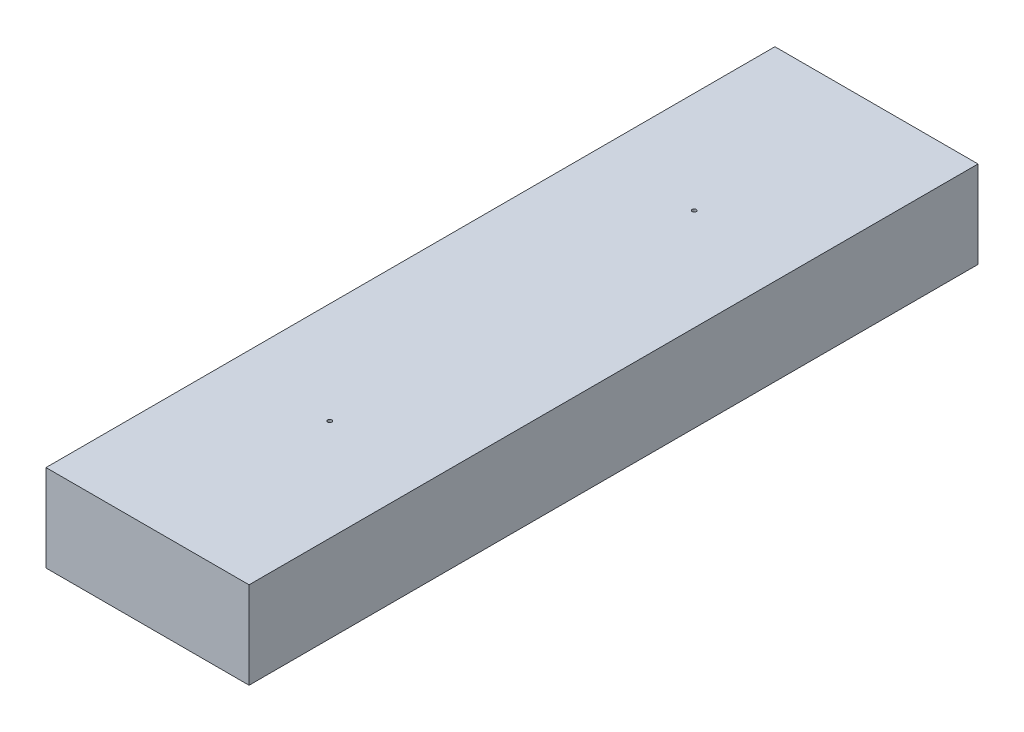
ISO-10303-21;
HEADER;
FILE_DESCRIPTION(('STEP AP214'),'2;1');
FILE_NAME('part.step','',(''),(''),'','','');
FILE_SCHEMA(('AUTOMOTIVE_DESIGN { 1 0 10303 214 1 1 1 1 }'));
ENDSEC;
DATA;
#1=APPLICATION_CONTEXT('core data for automotive mechanical design processes');
#2=APPLICATION_PROTOCOL_DEFINITION('international standard','automotive_design',2000,#1);
#3=PRODUCT_CONTEXT('',#1,'mechanical');
#4=PRODUCT('Part','Part','',(#3));
#5=PRODUCT_RELATED_PRODUCT_CATEGORY('part','',(#4));
#6=PRODUCT_DEFINITION_FORMATION('','',#4);
#7=PRODUCT_DEFINITION_CONTEXT('part definition',#1,'design');
#8=PRODUCT_DEFINITION('design','',#6,#7);
#9=PRODUCT_DEFINITION_SHAPE('','',#8);
#10=(LENGTH_UNIT() NAMED_UNIT(*) SI_UNIT(.MILLI.,.METRE.));
#11=(NAMED_UNIT(*) PLANE_ANGLE_UNIT() SI_UNIT($,.RADIAN.));
#12=(NAMED_UNIT(*) SI_UNIT($,.STERADIAN.) SOLID_ANGLE_UNIT());
#13=UNCERTAINTY_MEASURE_WITH_UNIT(LENGTH_MEASURE(1.E-05),#10,'distance_accuracy_value','');
#14=(GEOMETRIC_REPRESENTATION_CONTEXT(3) GLOBAL_UNCERTAINTY_ASSIGNED_CONTEXT((#13)) GLOBAL_UNIT_ASSIGNED_CONTEXT((#10,
#11,#12)) REPRESENTATION_CONTEXT('',''));
#15=CARTESIAN_POINT('',(0.,0.,0.));
#16=DIRECTION('',(0.,0.,1.));
#17=DIRECTION('',(1.,0.,0.));
#18=AXIS2_PLACEMENT_3D('',#15,#16,#17);
#19=CARTESIAN_POINT('',(0.,0.,319.0875));
#20=DIRECTION('',(1.,0.,0.));
#21=DIRECTION('',(0.,0.,-1.));
#22=AXIS2_PLACEMENT_3D('',#19,#20,#21);
#23=PLANE('',#22);
#24=DIRECTION('',(0.,-1.,0.));
#25=VECTOR('',#24,1.);
#26=CARTESIAN_POINT('',(0.,0.,0.));
#27=LINE('',#26,#25);
#28=CARTESIAN_POINT('',(0.,38.1,0.));
#29=VERTEX_POINT('',#28);
#30=CARTESIAN_POINT('',(0.,0.,0.));
#31=VERTEX_POINT('',#30);
#32=EDGE_CURVE('E95',#29,#31,#27,.T.);
#33=ORIENTED_EDGE('',*,*,#32,.T.);
#34=DIRECTION('',(0.,0.,-1.));
#35=VECTOR('',#34,1.);
#36=CARTESIAN_POINT('',(0.,0.,319.0875));
#37=LINE('',#36,#35);
#38=CARTESIAN_POINT('',(0.,0.,319.0875));
#39=VERTEX_POINT('',#38);
#40=EDGE_CURVE('E11',#39,#31,#37,.T.);
#41=ORIENTED_EDGE('',*,*,#40,.F.);
#42=DIRECTION('',(0.,-1.,0.));
#43=VECTOR('',#42,1.);
#44=CARTESIAN_POINT('',(0.,0.,319.0875));
#45=LINE('',#44,#43);
#46=CARTESIAN_POINT('',(0.,38.1,319.0875));
#47=VERTEX_POINT('',#46);
#48=EDGE_CURVE('E83',#47,#39,#45,.T.);
#49=ORIENTED_EDGE('',*,*,#48,.F.);
#50=DIRECTION('',(0.,0.,-1.));
#51=VECTOR('',#50,1.);
#52=CARTESIAN_POINT('',(0.,38.1,319.0875));
#53=LINE('',#52,#51);
#54=EDGE_CURVE('E91',#47,#29,#53,.T.);
#55=ORIENTED_EDGE('',*,*,#54,.T.);
#56=EDGE_LOOP('',(#33,#41,#49,#55));
#57=FACE_BOUND('',#56,.T.);
#58=ADVANCED_FACE('F32',(#57),#23,.F.);
#59=CARTESIAN_POINT('',(0.,0.,319.0875));
#60=DIRECTION('',(0.,1.,0.));
#61=DIRECTION('',(0.,0.,1.));
#62=AXIS2_PLACEMENT_3D('',#59,#60,#61);
#63=PLANE('',#62);
#64=CARTESIAN_POINT('',(44.45,0.,239.315625));
#65=DIRECTION('',(0.,-1.,0.));
#66=DIRECTION('',(0.,0.,-1.));
#67=AXIS2_PLACEMENT_3D('',#64,#65,#66);
#68=CIRCLE('',#67,0.889000000000026);
#69=CARTESIAN_POINT('',(44.45,0.,238.426625));
#70=VERTEX_POINT('',#69);
#71=EDGE_CURVE('E117',#70,#70,#68,.T.);
#72=ORIENTED_EDGE('',*,*,#71,.F.);
#73=EDGE_LOOP('',(#72));
#74=FACE_BOUND('',#73,.T.);
#75=CARTESIAN_POINT('',(44.45,0.,79.771875));
#76=DIRECTION('',(0.,-1.,0.));
#77=DIRECTION('',(0.,0.,-1.));
#78=AXIS2_PLACEMENT_3D('',#75,#76,#77);
#79=CIRCLE('',#78,0.889000000000002);
#80=CARTESIAN_POINT('',(44.45,0.,78.882875));
#81=VERTEX_POINT('',#80);
#82=EDGE_CURVE('E111',#81,#81,#79,.T.);
#83=ORIENTED_EDGE('',*,*,#82,.F.);
#84=EDGE_LOOP('',(#83));
#85=FACE_BOUND('',#84,.T.);
#86=DIRECTION('',(1.,0.,0.));
#87=VECTOR('',#86,1.);
#88=CARTESIAN_POINT('',(0.,0.,0.));
#89=LINE('',#88,#87);
#90=CARTESIAN_POINT('',(88.9,0.,0.));
#91=VERTEX_POINT('',#90);
#92=EDGE_CURVE('E87',#31,#91,#89,.T.);
#93=ORIENTED_EDGE('',*,*,#92,.T.);
#94=DIRECTION('',(0.,0.,-1.));
#95=VECTOR('',#94,1.);
#96=CARTESIAN_POINT('',(88.9,0.,319.0875));
#97=LINE('',#96,#95);
#98=CARTESIAN_POINT('',(88.9,0.,319.0875));
#99=VERTEX_POINT('',#98);
#100=EDGE_CURVE('E40',#99,#91,#97,.T.);
#101=ORIENTED_EDGE('',*,*,#100,.F.);
#102=DIRECTION('',(1.,0.,0.));
#103=VECTOR('',#102,1.);
#104=CARTESIAN_POINT('',(0.,0.,319.0875));
#105=LINE('',#104,#103);
#106=EDGE_CURVE('E78',#39,#99,#105,.T.);
#107=ORIENTED_EDGE('',*,*,#106,.F.);
#108=ORIENTED_EDGE('',*,*,#40,.T.);
#109=EDGE_LOOP('',(#93,#101,#107,#108));
#110=FACE_BOUND('',#109,.T.);
#111=ADVANCED_FACE('F86',(#74,#85,#110),#63,.F.);
#112=CARTESIAN_POINT('',(88.9,0.,319.0875));
#113=DIRECTION('',(-1.,0.,0.));
#114=DIRECTION('',(0.,0.,1.));
#115=AXIS2_PLACEMENT_3D('',#112,#113,#114);
#116=PLANE('',#115);
#117=DIRECTION('',(0.,1.,0.));
#118=VECTOR('',#117,1.);
#119=CARTESIAN_POINT('',(88.9,0.,0.));
#120=LINE('',#119,#118);
#121=CARTESIAN_POINT('',(88.9,38.1,0.));
#122=VERTEX_POINT('',#121);
#123=EDGE_CURVE('E65',#91,#122,#120,.T.);
#124=ORIENTED_EDGE('',*,*,#123,.T.);
#125=DIRECTION('',(0.,0.,-1.));
#126=VECTOR('',#125,1.);
#127=CARTESIAN_POINT('',(88.9,38.1,319.0875));
#128=LINE('',#127,#126);
#129=CARTESIAN_POINT('',(88.9,38.1,319.0875));
#130=VERTEX_POINT('',#129);
#131=EDGE_CURVE('E88',#130,#122,#128,.T.);
#132=ORIENTED_EDGE('',*,*,#131,.F.);
#133=DIRECTION('',(0.,1.,0.));
#134=VECTOR('',#133,1.);
#135=CARTESIAN_POINT('',(88.9,0.,319.0875));
#136=LINE('',#135,#134);
#137=EDGE_CURVE('E81',#99,#130,#136,.T.);
#138=ORIENTED_EDGE('',*,*,#137,.F.);
#139=ORIENTED_EDGE('',*,*,#100,.T.);
#140=EDGE_LOOP('',(#124,#132,#138,#139));
#141=FACE_BOUND('',#140,.T.);
#142=ADVANCED_FACE('F89',(#141),#116,.F.);
#143=CARTESIAN_POINT('',(0.,38.1,319.0875));
#144=DIRECTION('',(0.,-1.,0.));
#145=DIRECTION('',(0.,0.,-1.));
#146=AXIS2_PLACEMENT_3D('',#143,#144,#145);
#147=PLANE('',#146);
#148=CARTESIAN_POINT('',(44.45,38.1,239.315625));
#149=DIRECTION('',(0.,-1.,0.));
#150=DIRECTION('',(0.,0.,-1.));
#151=AXIS2_PLACEMENT_3D('',#148,#149,#150);
#152=CIRCLE('',#151,0.889000000000026);
#153=CARTESIAN_POINT('',(44.45,38.1,238.426625));
#154=VERTEX_POINT('',#153);
#155=EDGE_CURVE('E114',#154,#154,#152,.F.);
#156=ORIENTED_EDGE('',*,*,#155,.F.);
#157=EDGE_LOOP('',(#156));
#158=FACE_BOUND('',#157,.T.);
#159=CARTESIAN_POINT('',(44.45,38.1,79.771875));
#160=DIRECTION('',(0.,-1.,0.));
#161=DIRECTION('',(0.,0.,-1.));
#162=AXIS2_PLACEMENT_3D('',#159,#160,#161);
#163=CIRCLE('',#162,0.889000000000002);
#164=CARTESIAN_POINT('',(44.45,38.1,78.882875));
#165=VERTEX_POINT('',#164);
#166=EDGE_CURVE('E98',#165,#165,#163,.F.);
#167=ORIENTED_EDGE('',*,*,#166,.F.);
#168=EDGE_LOOP('',(#167));
#169=FACE_BOUND('',#168,.T.);
#170=DIRECTION('',(-1.,0.,0.));
#171=VECTOR('',#170,1.);
#172=CARTESIAN_POINT('',(0.,38.1,0.));
#173=LINE('',#172,#171);
#174=EDGE_CURVE('E71',#122,#29,#173,.T.);
#175=ORIENTED_EDGE('',*,*,#174,.T.);
#176=ORIENTED_EDGE('',*,*,#54,.F.);
#177=DIRECTION('',(-1.,0.,0.));
#178=VECTOR('',#177,1.);
#179=CARTESIAN_POINT('',(0.,38.1,319.0875));
#180=LINE('',#179,#178);
#181=EDGE_CURVE('E48',#130,#47,#180,.T.);
#182=ORIENTED_EDGE('',*,*,#181,.F.);
#183=ORIENTED_EDGE('',*,*,#131,.T.);
#184=EDGE_LOOP('',(#175,#176,#182,#183));
#185=FACE_BOUND('',#184,.T.);
#186=ADVANCED_FACE('F103',(#158,#169,#185),#147,.F.);
#187=CARTESIAN_POINT('',(0.,0.,319.0875));
#188=DIRECTION('',(0.,0.,-1.));
#189=DIRECTION('',(-1.,0.,0.));
#190=AXIS2_PLACEMENT_3D('',#187,#188,#189);
#191=PLANE('',#190);
#192=ORIENTED_EDGE('',*,*,#48,.T.);
#193=ORIENTED_EDGE('',*,*,#106,.T.);
#194=ORIENTED_EDGE('',*,*,#137,.T.);
#195=ORIENTED_EDGE('',*,*,#181,.T.);
#196=EDGE_LOOP('',(#192,#193,#194,#195));
#197=FACE_BOUND('',#196,.T.);
#198=ADVANCED_FACE('F79',(#197),#191,.F.);
#199=CARTESIAN_POINT('',(0.,0.,0.));
#200=DIRECTION('',(0.,0.,-1.));
#201=DIRECTION('',(-1.,0.,0.));
#202=AXIS2_PLACEMENT_3D('',#199,#200,#201);
#203=PLANE('',#202);
#204=ORIENTED_EDGE('',*,*,#32,.F.);
#205=ORIENTED_EDGE('',*,*,#174,.F.);
#206=ORIENTED_EDGE('',*,*,#123,.F.);
#207=ORIENTED_EDGE('',*,*,#92,.F.);
#208=EDGE_LOOP('',(#204,#205,#206,#207));
#209=FACE_BOUND('',#208,.T.);
#210=ADVANCED_FACE('F106',(#209),#203,.T.);
#211=CARTESIAN_POINT('',(44.45,40.6144717138994,79.771875));
#212=DIRECTION('',(0.,-1.,0.));
#213=DIRECTION('',(0.,0.,-1.));
#214=AXIS2_PLACEMENT_3D('',#211,#212,#213);
#215=CYLINDRICAL_SURFACE('',#214,0.889000000000002);
#216=ORIENTED_EDGE('',*,*,#166,.T.);
#217=EDGE_LOOP('',(#216));
#218=FACE_BOUND('',#217,.T.);
#219=ORIENTED_EDGE('',*,*,#82,.T.);
#220=EDGE_LOOP('',(#219));
#221=FACE_BOUND('',#220,.T.);
#222=ADVANCED_FACE('F127',(#218,#221),#215,.F.);
#223=CARTESIAN_POINT('',(44.45,40.6144717138994,239.315625));
#224=DIRECTION('',(0.,-1.,0.));
#225=DIRECTION('',(0.,0.,-1.));
#226=AXIS2_PLACEMENT_3D('',#223,#224,#225);
#227=CYLINDRICAL_SURFACE('',#226,0.889000000000026);
#228=ORIENTED_EDGE('',*,*,#155,.T.);
#229=EDGE_LOOP('',(#228));
#230=FACE_BOUND('',#229,.T.);
#231=ORIENTED_EDGE('',*,*,#71,.T.);
#232=EDGE_LOOP('',(#231));
#233=FACE_BOUND('',#232,.T.);
#234=ADVANCED_FACE('F121',(#230,#233),#227,.F.);
#235=CLOSED_SHELL('',(#58,#111,#142,#186,#198,#210,#222,#234));
#236=MANIFOLD_SOLID_BREP('B2',#235);
#237=ADVANCED_BREP_SHAPE_REPRESENTATION('',(#18,#236),#14);
#238=SHAPE_DEFINITION_REPRESENTATION(#9,#237);
ENDSEC;
END-ISO-10303-21;
